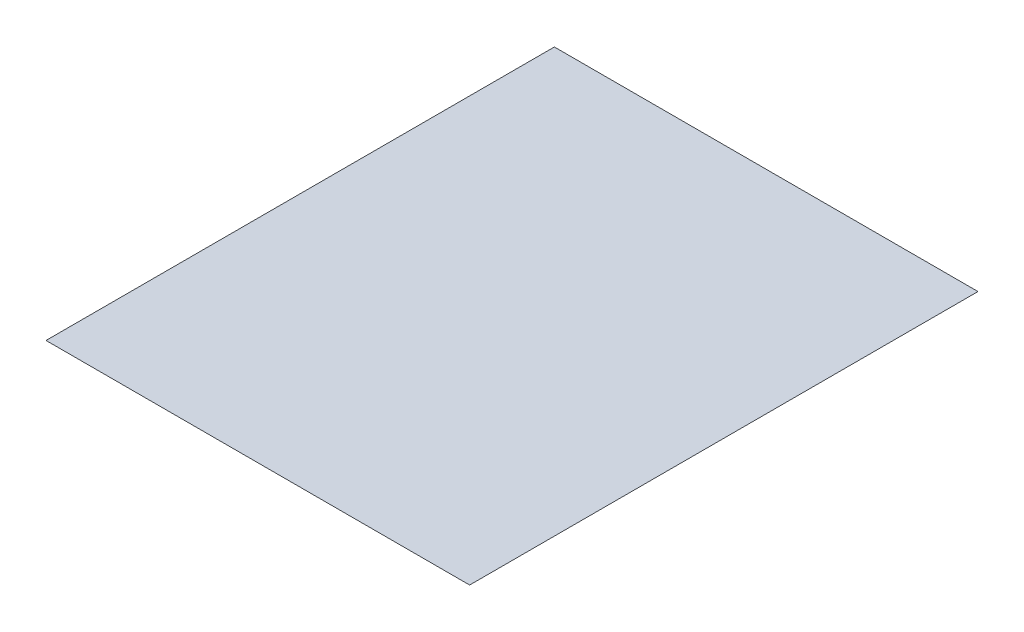
ISO-10303-21;
HEADER;
FILE_DESCRIPTION(('STEP AP214'),'2;1');
FILE_NAME('part.step','',(''),(''),'','','');
FILE_SCHEMA(('AUTOMOTIVE_DESIGN { 1 0 10303 214 1 1 1 1 }'));
ENDSEC;
DATA;
#1=APPLICATION_CONTEXT('core data for automotive mechanical design processes');
#2=APPLICATION_PROTOCOL_DEFINITION('international standard','automotive_design',2000,#1);
#3=PRODUCT_CONTEXT('',#1,'mechanical');
#4=PRODUCT('Part','Part','',(#3));
#5=PRODUCT_RELATED_PRODUCT_CATEGORY('part','',(#4));
#6=PRODUCT_DEFINITION_FORMATION('','',#4);
#7=PRODUCT_DEFINITION_CONTEXT('part definition',#1,'design');
#8=PRODUCT_DEFINITION('design','',#6,#7);
#9=PRODUCT_DEFINITION_SHAPE('','',#8);
#10=(LENGTH_UNIT() NAMED_UNIT(*) SI_UNIT(.MILLI.,.METRE.));
#11=(NAMED_UNIT(*) PLANE_ANGLE_UNIT() SI_UNIT($,.RADIAN.));
#12=(NAMED_UNIT(*) SI_UNIT($,.STERADIAN.) SOLID_ANGLE_UNIT());
#13=UNCERTAINTY_MEASURE_WITH_UNIT(LENGTH_MEASURE(1.E-05),#10,'distance_accuracy_value','');
#14=(GEOMETRIC_REPRESENTATION_CONTEXT(3) GLOBAL_UNCERTAINTY_ASSIGNED_CONTEXT((#13)) GLOBAL_UNIT_ASSIGNED_CONTEXT((#10,
#11,#12)) REPRESENTATION_CONTEXT('',''));
#15=CARTESIAN_POINT('',(0.,0.,0.));
#16=DIRECTION('',(0.,0.,1.));
#17=DIRECTION('',(1.,0.,0.));
#18=AXIS2_PLACEMENT_3D('',#15,#16,#17);
#19=CARTESIAN_POINT('',(0.,180.,22.5));
#20=DIRECTION('',(0.,0.,-1.));
#21=DIRECTION('',(-1.,0.,0.));
#22=AXIS2_PLACEMENT_3D('',#19,#20,#21);
#23=CYLINDRICAL_SURFACE('',#22,5.);
#24=CARTESIAN_POINT('',(0.,180.,22.5));
#25=DIRECTION('',(0.,0.,1.));
#26=DIRECTION('',(1.,0.,0.));
#27=AXIS2_PLACEMENT_3D('',#24,#25,#26);
#28=CIRCLE('',#27,5.);
#29=CARTESIAN_POINT('',(-5.00000000000001,180.,22.5));
#30=VERTEX_POINT('',#29);
#31=EDGE_CURVE('E392',#30,#30,#28,.T.);
#32=CARTESIAN_POINT('',(0.,180.,-22.5));
#33=DIRECTION('',(0.,0.,1.));
#34=DIRECTION('',(1.,0.,0.));
#35=AXIS2_PLACEMENT_3D('',#32,#33,#34);
#36=CIRCLE('',#35,5.);
#37=CARTESIAN_POINT('',(-5.00000000000001,180.,-22.5));
#38=VERTEX_POINT('',#37);
#39=EDGE_CURVE('E389',#38,#38,#36,.T.);
#40=CARTESIAN_POINT('',(-5.00000000000001,180.,22.5));
#41=CARTESIAN_POINT('',(-5.00000000000001,180.,22.03125));
#42=CARTESIAN_POINT('',(-5.00000000000001,180.,21.5625));
#43=CARTESIAN_POINT('',(-5.00000000000001,180.,20.625));
#44=CARTESIAN_POINT('',(-5.00000000000001,180.,20.15625));
#45=CARTESIAN_POINT('',(-5.00000000000001,180.,19.21875));
#46=CARTESIAN_POINT('',(-5.00000000000001,180.,18.75));
#47=CARTESIAN_POINT('',(-5.00000000000001,180.,17.8125));
#48=CARTESIAN_POINT('',(-5.00000000000001,180.,17.34375));
#49=CARTESIAN_POINT('',(-5.00000000000001,180.,16.40625));
#50=CARTESIAN_POINT('',(-5.00000000000001,180.,15.9375));
#51=CARTESIAN_POINT('',(-5.00000000000001,180.,15.));
#52=CARTESIAN_POINT('',(-5.00000000000001,180.,14.53125));
#53=CARTESIAN_POINT('',(-5.00000000000001,180.,13.59375));
#54=CARTESIAN_POINT('',(-5.00000000000001,180.,13.125));
#55=CARTESIAN_POINT('',(-5.00000000000001,180.,12.1875));
#56=CARTESIAN_POINT('',(-5.00000000000001,180.,11.71875));
#57=CARTESIAN_POINT('',(-5.00000000000001,180.,10.78125));
#58=CARTESIAN_POINT('',(-5.00000000000001,180.,10.3125));
#59=CARTESIAN_POINT('',(-5.00000000000001,180.,9.37499999999999));
#60=CARTESIAN_POINT('',(-5.00000000000001,180.,8.90625));
#61=CARTESIAN_POINT('',(-5.00000000000001,180.,7.96874999999999));
#62=CARTESIAN_POINT('',(-5.00000000000001,180.,7.5));
#63=CARTESIAN_POINT('',(-5.00000000000001,180.,6.5625));
#64=CARTESIAN_POINT('',(-5.00000000000001,180.,6.09374999999999));
#65=CARTESIAN_POINT('',(-5.00000000000001,180.,5.15624999999999));
#66=CARTESIAN_POINT('',(-5.00000000000001,180.,4.68749999999999));
#67=CARTESIAN_POINT('',(-5.00000000000001,180.,3.74999999999999));
#68=CARTESIAN_POINT('',(-5.00000000000001,180.,3.28124999999999));
#69=CARTESIAN_POINT('',(-5.00000000000001,180.,2.34375));
#70=CARTESIAN_POINT('',(-5.00000000000001,180.,1.87499999999999));
#71=CARTESIAN_POINT('',(-5.00000000000001,180.,0.937499999999994));
#72=CARTESIAN_POINT('',(-5.00000000000001,180.,0.468749999999993));
#73=CARTESIAN_POINT('',(-5.00000000000001,180.,-0.468750000000007));
#74=CARTESIAN_POINT('',(-5.00000000000001,180.,-0.937500000000008));
#75=CARTESIAN_POINT('',(-5.00000000000001,180.,-1.87500000000001));
#76=CARTESIAN_POINT('',(-5.00000000000001,180.,-2.34375000000001));
#77=CARTESIAN_POINT('',(-5.00000000000001,180.,-3.28125000000001));
#78=CARTESIAN_POINT('',(-5.00000000000001,180.,-3.75000000000001));
#79=CARTESIAN_POINT('',(-5.00000000000001,180.,-4.68750000000001));
#80=CARTESIAN_POINT('',(-5.00000000000001,180.,-5.15625000000001));
#81=CARTESIAN_POINT('',(-5.00000000000001,180.,-6.09375000000001));
#82=CARTESIAN_POINT('',(-5.00000000000001,180.,-6.56250000000001));
#83=CARTESIAN_POINT('',(-5.00000000000001,180.,-7.50000000000001));
#84=CARTESIAN_POINT('',(-5.00000000000001,180.,-7.96875000000001));
#85=CARTESIAN_POINT('',(-5.00000000000001,180.,-8.90625000000001));
#86=CARTESIAN_POINT('',(-5.00000000000001,180.,-9.37500000000001));
#87=CARTESIAN_POINT('',(-5.00000000000001,180.,-10.3125));
#88=CARTESIAN_POINT('',(-5.00000000000001,180.,-10.78125));
#89=CARTESIAN_POINT('',(-5.00000000000001,180.,-11.71875));
#90=CARTESIAN_POINT('',(-5.00000000000001,180.,-12.1875));
#91=CARTESIAN_POINT('',(-5.00000000000001,180.,-13.125));
#92=CARTESIAN_POINT('',(-5.00000000000001,180.,-13.59375));
#93=CARTESIAN_POINT('',(-5.00000000000001,180.,-14.53125));
#94=CARTESIAN_POINT('',(-5.00000000000001,180.,-15.));
#95=CARTESIAN_POINT('',(-5.00000000000001,180.,-15.9375));
#96=CARTESIAN_POINT('',(-5.00000000000001,180.,-16.40625));
#97=CARTESIAN_POINT('',(-5.00000000000001,180.,-17.34375));
#98=CARTESIAN_POINT('',(-5.00000000000001,180.,-17.8125));
#99=CARTESIAN_POINT('',(-5.00000000000001,180.,-18.75));
#100=CARTESIAN_POINT('',(-5.00000000000001,180.,-19.21875));
#101=CARTESIAN_POINT('',(-5.00000000000001,180.,-20.15625));
#102=CARTESIAN_POINT('',(-5.00000000000001,180.,-20.625));
#103=CARTESIAN_POINT('',(-5.00000000000001,180.,-21.5625));
#104=CARTESIAN_POINT('',(-5.00000000000001,180.,-22.03125));
#105=CARTESIAN_POINT('',(-5.00000000000001,180.,-22.5));
#106=B_SPLINE_CURVE_WITH_KNOTS('',3,(#40,#41,#42,#43,#44,#45,#46,#47,#48,#49,#50,#51,#52,#53,
#54,#55,#56,#57,#58,#59,#60,#61,#62,#63,#64,#65,#66,#67,#68,#69,#70,#71,#72,#73,#74,#75,#76,#77,
#78,#79,#80,#81,#82,#83,#84,#85,#86,#87,#88,#89,#90,#91,#92,#93,#94,#95,#96,#97,#98,#99,#100,
#101,#102,#103,#104,#105),.UNSPECIFIED.,.F.,.F.,(4,2,2,2,2,2,2,2,2,2,2,2,2,2,2,2,2,2,2,2,2,2,2,
2,2,2,2,2,2,2,2,2,4),(0.,1.40625,2.8125,4.21875,5.625,7.03125,8.4375,9.84375,11.25,12.65625,
14.0625,15.46875,16.875,18.28125,19.6875,21.09375,22.5,23.90625,25.3125,26.71875,28.125,
29.53125,30.9375,32.34375,33.75,35.15625,36.5625,37.96875,39.375,40.78125,42.1875,43.59375,45.),.UNSPECIFIED.);
#107=EDGE_CURVE('BSEAM41',#30,#38,#106,.T.);
#108=ORIENTED_EDGE('',*,*,#31,.F.);
#109=ORIENTED_EDGE('',*,*,#39,.T.);
#110=ORIENTED_EDGE('',*,*,#107,.T.);
#111=ORIENTED_EDGE('',*,*,#107,.F.);
#112=EDGE_LOOP('',(#108,#110,#109,#111));
#113=FACE_BOUND('',#112,.T.);
#114=ADVANCED_FACE('F41',(#113),#23,.T.);
#115=CARTESIAN_POINT('',(0.,180.,32.5));
#116=DIRECTION('',(0.,0.,-1.));
#117=DIRECTION('',(-1.,0.,0.));
#118=AXIS2_PLACEMENT_3D('',#115,#116,#117);
#119=CYLINDRICAL_SURFACE('',#118,20.);
#120=DIRECTION('',(0.,0.,-1.));
#121=VECTOR('',#120,1.);
#122=CARTESIAN_POINT('',(20.,180.,32.5));
#123=LINE('',#122,#121);
#124=CARTESIAN_POINT('',(20.,180.,32.5));
#125=VERTEX_POINT('',#124);
#126=CARTESIAN_POINT('',(20.,180.,22.5));
#127=VERTEX_POINT('',#126);
#128=EDGE_CURVE('E398',#125,#127,#123,.T.);
#129=ORIENTED_EDGE('',*,*,#128,.F.);
#130=CARTESIAN_POINT('',(0.,180.,32.5));
#131=DIRECTION('',(0.,0.,-1.));
#132=DIRECTION('',(-1.,0.,0.));
#133=AXIS2_PLACEMENT_3D('',#130,#131,#132);
#134=CIRCLE('',#133,20.);
#135=CARTESIAN_POINT('',(-20.,180.,32.5));
#136=VERTEX_POINT('',#135);
#137=EDGE_CURVE('E384',#125,#136,#134,.T.);
#138=ORIENTED_EDGE('',*,*,#137,.T.);
#139=DIRECTION('',(0.,0.,-1.));
#140=VECTOR('',#139,1.);
#141=CARTESIAN_POINT('',(-20.,180.,32.5));
#142=LINE('',#141,#140);
#143=CARTESIAN_POINT('',(-20.,180.,22.5));
#144=VERTEX_POINT('',#143);
#145=EDGE_CURVE('E406',#136,#144,#142,.T.);
#146=ORIENTED_EDGE('',*,*,#145,.T.);
#147=CARTESIAN_POINT('',(0.,180.,22.5));
#148=DIRECTION('',(0.,0.,1.));
#149=DIRECTION('',(1.,0.,0.));
#150=AXIS2_PLACEMENT_3D('',#147,#148,#149);
#151=CIRCLE('',#150,20.);
#152=EDGE_CURVE('E419',#144,#127,#151,.T.);
#153=ORIENTED_EDGE('',*,*,#152,.T.);
#154=EDGE_LOOP('',(#129,#138,#146,#153));
#155=FACE_BOUND('',#154,.T.);
#156=ADVANCED_FACE('F314',(#155),#119,.T.);
#157=CARTESIAN_POINT('',(20.,205.,32.5));
#158=DIRECTION('',(-1.,0.,0.));
#159=DIRECTION('',(0.,0.,1.));
#160=AXIS2_PLACEMENT_3D('',#157,#158,#159);
#161=PLANE('',#160);
#162=DIRECTION('',(0.,1.,0.));
#163=VECTOR('',#162,1.);
#164=CARTESIAN_POINT('',(20.,205.,22.5));
#165=LINE('',#164,#163);
#166=CARTESIAN_POINT('',(20.,205.,22.5));
#167=VERTEX_POINT('',#166);
#168=EDGE_CURVE('E416',#127,#167,#165,.T.);
#169=ORIENTED_EDGE('',*,*,#168,.T.);
#170=DIRECTION('',(0.,0.,-1.));
#171=VECTOR('',#170,1.);
#172=CARTESIAN_POINT('',(20.,205.,32.5));
#173=LINE('',#172,#171);
#174=CARTESIAN_POINT('',(20.,205.,32.5));
#175=VERTEX_POINT('',#174);
#176=EDGE_CURVE('E401',#175,#167,#173,.T.);
#177=ORIENTED_EDGE('',*,*,#176,.F.);
#178=DIRECTION('',(0.,1.,0.));
#179=VECTOR('',#178,1.);
#180=CARTESIAN_POINT('',(20.,205.,32.5));
#181=LINE('',#180,#179);
#182=EDGE_CURVE('E412',#125,#175,#181,.T.);
#183=ORIENTED_EDGE('',*,*,#182,.F.);
#184=ORIENTED_EDGE('',*,*,#128,.T.);
#185=EDGE_LOOP('',(#169,#177,#183,#184));
#186=FACE_BOUND('',#185,.T.);
#187=ADVANCED_FACE('F310',(#186),#161,.F.);
#188=CARTESIAN_POINT('',(-20.,180.,32.5));
#189=DIRECTION('',(1.,0.,0.));
#190=DIRECTION('',(0.,0.,-1.));
#191=AXIS2_PLACEMENT_3D('',#188,#189,#190);
#192=PLANE('',#191);
#193=DIRECTION('',(0.,-1.,0.));
#194=VECTOR('',#193,1.);
#195=CARTESIAN_POINT('',(-20.,180.,22.5));
#196=LINE('',#195,#194);
#197=CARTESIAN_POINT('',(-20.,205.,22.5));
#198=VERTEX_POINT('',#197);
#199=EDGE_CURVE('E410',#198,#144,#196,.T.);
#200=ORIENTED_EDGE('',*,*,#199,.T.);
#201=ORIENTED_EDGE('',*,*,#145,.F.);
#202=DIRECTION('',(0.,-1.,0.));
#203=VECTOR('',#202,1.);
#204=CARTESIAN_POINT('',(-20.,180.,32.5));
#205=LINE('',#204,#203);
#206=CARTESIAN_POINT('',(-20.,205.,32.5));
#207=VERTEX_POINT('',#206);
#208=EDGE_CURVE('E409',#207,#136,#205,.T.);
#209=ORIENTED_EDGE('',*,*,#208,.F.);
#210=DIRECTION('',(0.,0.,-1.));
#211=VECTOR('',#210,1.);
#212=CARTESIAN_POINT('',(-20.,205.,32.5));
#213=LINE('',#212,#211);
#214=EDGE_CURVE('E404',#207,#198,#213,.T.);
#215=ORIENTED_EDGE('',*,*,#214,.T.);
#216=EDGE_LOOP('',(#200,#201,#209,#215));
#217=FACE_BOUND('',#216,.T.);
#218=ADVANCED_FACE('F306',(#217),#192,.F.);
#219=CARTESIAN_POINT('',(0.,180.,22.5));
#220=DIRECTION('',(0.,0.,1.));
#221=DIRECTION('',(1.,0.,0.));
#222=AXIS2_PLACEMENT_3D('',#219,#220,#221);
#223=PLANE('',#222);
#224=ORIENTED_EDGE('',*,*,#31,.T.);
#225=EDGE_LOOP('',(#224));
#226=FACE_BOUND('',#225,.T.);
#227=ORIENTED_EDGE('',*,*,#152,.F.);
#228=ORIENTED_EDGE('',*,*,#199,.F.);
#229=DIRECTION('',(-1.,0.,0.));
#230=VECTOR('',#229,1.);
#231=CARTESIAN_POINT('',(-20.,205.,22.5));
#232=LINE('',#231,#230);
#233=EDGE_CURVE('E413',#167,#198,#232,.T.);
#234=ORIENTED_EDGE('',*,*,#233,.F.);
#235=ORIENTED_EDGE('',*,*,#168,.F.);
#236=EDGE_LOOP('',(#227,#228,#234,#235));
#237=FACE_BOUND('',#236,.T.);
#238=ADVANCED_FACE('F303',(#226,#237),#223,.F.);
#239=CARTESIAN_POINT('',(0.,180.,32.5));
#240=DIRECTION('',(0.,0.,1.));
#241=DIRECTION('',(1.,0.,0.));
#242=AXIS2_PLACEMENT_3D('',#239,#240,#241);
#243=SPHERICAL_SURFACE('',#242,20.);
#244=CARTESIAN_POINT('',(0.,180.,32.5));
#245=DIRECTION('',(0.,-1.,0.));
#246=DIRECTION('',(0.,0.,-1.));
#247=AXIS2_PLACEMENT_3D('',#244,#245,#246);
#248=CIRCLE('',#247,20.);
#249=EDGE_CURVE('E386',#136,#125,#248,.F.);
#250=ORIENTED_EDGE('',*,*,#249,.F.);
#251=ORIENTED_EDGE('',*,*,#137,.F.);
#252=EDGE_LOOP('',(#250,#251));
#253=FACE_BOUND('',#252,.T.);
#254=ADVANCED_FACE('F301',(#253),#243,.T.);
#255=CARTESIAN_POINT('',(0.,205.,32.5));
#256=DIRECTION('',(0.,-1.,0.));
#257=DIRECTION('',(0.,0.,-1.));
#258=AXIS2_PLACEMENT_3D('',#255,#256,#257);
#259=CYLINDRICAL_SURFACE('',#258,20.);
#260=ORIENTED_EDGE('',*,*,#249,.T.);
#261=ORIENTED_EDGE('',*,*,#182,.T.);
#262=CARTESIAN_POINT('',(0.,205.,32.5));
#263=DIRECTION('',(0.,1.,0.));
#264=DIRECTION('',(0.,0.,1.));
#265=AXIS2_PLACEMENT_3D('',#262,#263,#264);
#266=CIRCLE('',#265,20.);
#267=EDGE_CURVE('E395',#207,#175,#266,.T.);
#268=ORIENTED_EDGE('',*,*,#267,.F.);
#269=ORIENTED_EDGE('',*,*,#208,.T.);
#270=EDGE_LOOP('',(#260,#261,#268,#269));
#271=FACE_BOUND('',#270,.T.);
#272=ADVANCED_FACE('F297',(#271),#259,.T.);
#273=CARTESIAN_POINT('',(0.,180.,-52.5));
#274=DIRECTION('',(0.,0.,1.));
#275=DIRECTION('',(1.,0.,0.));
#276=AXIS2_PLACEMENT_3D('',#273,#274,#275);
#277=CYLINDRICAL_SURFACE('',#276,20.);
#278=DIRECTION('',(0.,0.,1.));
#279=VECTOR('',#278,1.);
#280=CARTESIAN_POINT('',(-20.,180.,-52.5));
#281=LINE('',#280,#279);
#282=CARTESIAN_POINT('',(-20.,180.,-32.5));
#283=VERTEX_POINT('',#282);
#284=CARTESIAN_POINT('',(-20.,180.,-22.5));
#285=VERTEX_POINT('',#284);
#286=EDGE_CURVE('E249',#283,#285,#281,.T.);
#287=ORIENTED_EDGE('',*,*,#286,.F.);
#288=CARTESIAN_POINT('',(0.,180.,-32.5));
#289=DIRECTION('',(0.,0.,1.));
#290=DIRECTION('',(1.,0.,0.));
#291=AXIS2_PLACEMENT_3D('',#288,#289,#290);
#292=CIRCLE('',#291,20.);
#293=CARTESIAN_POINT('',(20.,180.,-32.5));
#294=VERTEX_POINT('',#293);
#295=EDGE_CURVE('E346',#283,#294,#292,.T.);
#296=ORIENTED_EDGE('',*,*,#295,.T.);
#297=DIRECTION('',(0.,0.,1.));
#298=VECTOR('',#297,1.);
#299=CARTESIAN_POINT('',(20.,180.,-52.5));
#300=LINE('',#299,#298);
#301=CARTESIAN_POINT('',(20.,180.,-22.5));
#302=VERTEX_POINT('',#301);
#303=EDGE_CURVE('E247',#294,#302,#300,.T.);
#304=ORIENTED_EDGE('',*,*,#303,.T.);
#305=CARTESIAN_POINT('',(0.,180.,-22.5));
#306=DIRECTION('',(0.,0.,-1.));
#307=DIRECTION('',(-1.,0.,0.));
#308=AXIS2_PLACEMENT_3D('',#305,#306,#307);
#309=CIRCLE('',#308,20.);
#310=EDGE_CURVE('E370',#302,#285,#309,.T.);
#311=ORIENTED_EDGE('',*,*,#310,.T.);
#312=EDGE_LOOP('',(#287,#296,#304,#311));
#313=FACE_BOUND('',#312,.T.);
#314=ADVANCED_FACE('F292',(#313),#277,.T.);
#315=CARTESIAN_POINT('',(-20.,180.,-52.5));
#316=DIRECTION('',(1.,0.,0.));
#317=DIRECTION('',(0.,1.,0.));
#318=AXIS2_PLACEMENT_3D('',#315,#316,#317);
#319=PLANE('',#318);
#320=DIRECTION('',(0.,0.,1.));
#321=VECTOR('',#320,1.);
#322=CARTESIAN_POINT('',(-20.,205.,-52.5));
#323=LINE('',#322,#321);
#324=CARTESIAN_POINT('',(-20.,205.,-32.5));
#325=VERTEX_POINT('',#324);
#326=CARTESIAN_POINT('',(-20.,205.,-22.5));
#327=VERTEX_POINT('',#326);
#328=EDGE_CURVE('E246',#325,#327,#323,.T.);
#329=ORIENTED_EDGE('',*,*,#328,.F.);
#330=CARTESIAN_POINT('',(-20.,180.,-32.5));
#331=CARTESIAN_POINT('',(-20.,188.75,-32.5));
#332=CARTESIAN_POINT('',(-20.,197.5,-32.5));
#333=CARTESIAN_POINT('',(-20.,206.25,-32.5));
#334=(BOUNDED_CURVE() B_SPLINE_CURVE(3,(#330,#331,#332,#333),.UNSPECIFIED.,.F.,
.F.) B_SPLINE_CURVE_WITH_KNOTS((4,4),(-0.02625,0.),
.UNSPECIFIED.) CURVE() GEOMETRIC_REPRESENTATION_ITEM() RATIONAL_B_SPLINE_CURVE((1.,1.,1.,1.)) REPRESENTATION_ITEM(''));
#335=EDGE_CURVE('E165',#325,#283,#334,.F.);
#336=ORIENTED_EDGE('',*,*,#335,.T.);
#337=ORIENTED_EDGE('',*,*,#286,.T.);
#338=DIRECTION('',(0.,1.,0.));
#339=VECTOR('',#338,1.);
#340=CARTESIAN_POINT('',(-20.,180.,-22.5));
#341=LINE('',#340,#339);
#342=EDGE_CURVE('E378',#285,#327,#341,.T.);
#343=ORIENTED_EDGE('',*,*,#342,.T.);
#344=EDGE_LOOP('',(#329,#336,#337,#343));
#345=FACE_BOUND('',#344,.T.);
#346=ADVANCED_FACE('F282',(#345),#319,.F.);
#347=CARTESIAN_POINT('',(20.,205.,-52.5));
#348=DIRECTION('',(-1.,0.,0.));
#349=DIRECTION('',(0.,-1.,0.));
#350=AXIS2_PLACEMENT_3D('',#347,#348,#349);
#351=PLANE('',#350);
#352=ORIENTED_EDGE('',*,*,#303,.F.);
#353=CARTESIAN_POINT('',(20.,206.25,-32.5));
#354=CARTESIAN_POINT('',(20.,197.5,-32.5));
#355=CARTESIAN_POINT('',(20.,188.75,-32.5));
#356=CARTESIAN_POINT('',(20.,180.,-32.5));
#357=(BOUNDED_CURVE() B_SPLINE_CURVE(3,(#353,#354,#355,#356),.UNSPECIFIED.,.F.,
.F.) B_SPLINE_CURVE_WITH_KNOTS((4,4),(0.,0.02625),
.UNSPECIFIED.) CURVE() GEOMETRIC_REPRESENTATION_ITEM() RATIONAL_B_SPLINE_CURVE((1.,1.,1.,1.)) REPRESENTATION_ITEM(''));
#358=CARTESIAN_POINT('',(20.,205.,-32.5));
#359=VERTEX_POINT('',#358);
#360=EDGE_CURVE('E228',#294,#359,#357,.F.);
#361=ORIENTED_EDGE('',*,*,#360,.T.);
#362=DIRECTION('',(0.,0.,1.));
#363=VECTOR('',#362,1.);
#364=CARTESIAN_POINT('',(20.,205.,-52.5));
#365=LINE('',#364,#363);
#366=CARTESIAN_POINT('',(20.,205.,-22.5));
#367=VERTEX_POINT('',#366);
#368=EDGE_CURVE('E238',#359,#367,#365,.T.);
#369=ORIENTED_EDGE('',*,*,#368,.T.);
#370=DIRECTION('',(0.,-1.,0.));
#371=VECTOR('',#370,1.);
#372=CARTESIAN_POINT('',(20.,205.,-22.5));
#373=LINE('',#372,#371);
#374=EDGE_CURVE('E251',#367,#302,#373,.T.);
#375=ORIENTED_EDGE('',*,*,#374,.T.);
#376=EDGE_LOOP('',(#352,#361,#369,#375));
#377=FACE_BOUND('',#376,.T.);
#378=ADVANCED_FACE('F291',(#377),#351,.F.);
#379=CARTESIAN_POINT('',(0.,180.,-22.5));
#380=DIRECTION('',(0.,0.,-1.));
#381=DIRECTION('',(-1.,0.,0.));
#382=AXIS2_PLACEMENT_3D('',#379,#380,#381);
#383=PLANE('',#382);
#384=ORIENTED_EDGE('',*,*,#39,.F.);
#385=EDGE_LOOP('',(#384));
#386=FACE_BOUND('',#385,.T.);
#387=ORIENTED_EDGE('',*,*,#310,.F.);
#388=ORIENTED_EDGE('',*,*,#374,.F.);
#389=DIRECTION('',(1.,0.,0.));
#390=VECTOR('',#389,1.);
#391=CARTESIAN_POINT('',(-20.,205.,-22.5));
#392=LINE('',#391,#390);
#393=EDGE_CURVE('E243',#327,#367,#392,.T.);
#394=ORIENTED_EDGE('',*,*,#393,.F.);
#395=ORIENTED_EDGE('',*,*,#342,.F.);
#396=EDGE_LOOP('',(#387,#388,#394,#395));
#397=FACE_BOUND('',#396,.T.);
#398=ADVANCED_FACE('F188',(#386,#397),#383,.F.);
#399=CARTESIAN_POINT('',(20.,180.,-32.5));
#400=CARTESIAN_POINT('',(20.,188.75,-32.5));
#401=CARTESIAN_POINT('',(20.,197.5,-32.5));
#402=CARTESIAN_POINT('',(20.,206.25,-32.5));
#403=CARTESIAN_POINT('',(20.,180.,-52.5));
#404=CARTESIAN_POINT('',(19.9999999998179,188.75,-52.4999999997571));
#405=CARTESIAN_POINT('',(20.,197.5,-52.5));
#406=CARTESIAN_POINT('',(20.,206.25,-52.5));
#407=CARTESIAN_POINT('',(0.,180.,-52.5));
#408=CARTESIAN_POINT('',(0.,188.75,-52.5));
#409=CARTESIAN_POINT('',(0.,197.5,-52.5));
#410=CARTESIAN_POINT('',(0.,206.25,-52.5));
#411=(BOUNDED_SURFACE() B_SPLINE_SURFACE(2,3,((#399,#400,#401,#402),(#403,#404,#405,#406),(#407,
#408,#409,#410)),.UNSPECIFIED.,.F.,.F.,.F.) B_SPLINE_SURFACE_WITH_KNOTS((3,3),(4,4),(0.,1.),(0.,
0.02625),.UNSPECIFIED.) GEOMETRIC_REPRESENTATION_ITEM() RATIONAL_B_SPLINE_SURFACE(((1.,1.,1.,
1.),(0.707106781186548,0.707106781186548,0.707106781186548,0.707106781186548),(1.,1.,1.,1.))) REPRESENTATION_ITEM('') SURFACE());
#412=CARTESIAN_POINT('',(0.,206.25,-52.5));
#413=CARTESIAN_POINT('',(0.,197.5,-52.5));
#414=CARTESIAN_POINT('',(0.,188.75,-52.5));
#415=CARTESIAN_POINT('',(0.,180.,-52.5));
#416=(BOUNDED_CURVE() B_SPLINE_CURVE(3,(#412,#413,#414,#415),.UNSPECIFIED.,.F.,
.F.) B_SPLINE_CURVE_WITH_KNOTS((4,4),(-0.02625,0.),
.UNSPECIFIED.) CURVE() GEOMETRIC_REPRESENTATION_ITEM() RATIONAL_B_SPLINE_CURVE((1.,1.,1.,1.)) REPRESENTATION_ITEM(''));
#417=CARTESIAN_POINT('',(0.,205.,-52.5));
#418=VERTEX_POINT('',#417);
#419=CARTESIAN_POINT('',(0.,180.,-52.5));
#420=VERTEX_POINT('',#419);
#421=EDGE_CURVE('E230',#418,#420,#416,.T.);
#422=CARTESIAN_POINT('',(0.,205.,-52.5));
#423=CARTESIAN_POINT('',(19.9999999999988,205.,-52.4999999999984));
#424=CARTESIAN_POINT('',(20.,205.,-32.5));
#425=(BOUNDED_CURVE() B_SPLINE_CURVE(2,(#422,#423,#424),.UNSPECIFIED.,.F.,
.F.) B_SPLINE_CURVE_WITH_KNOTS((3,3),(0.,1.),
.UNSPECIFIED.) CURVE() GEOMETRIC_REPRESENTATION_ITEM() RATIONAL_B_SPLINE_CURVE((1.,
0.707106781186548,1.)) REPRESENTATION_ITEM(''));
#426=EDGE_CURVE('E225',#359,#418,#425,.F.);
#427=CARTESIAN_POINT('',(20.,180.,-32.5));
#428=CARTESIAN_POINT('',(20.,180.,-52.5));
#429=CARTESIAN_POINT('',(0.,180.,-52.5));
#430=(BOUNDED_CURVE() B_SPLINE_CURVE(2,(#427,#428,#429),.UNSPECIFIED.,.F.,
.F.) B_SPLINE_CURVE_WITH_KNOTS((3,3),(0.,1.),
.UNSPECIFIED.) CURVE() GEOMETRIC_REPRESENTATION_ITEM() RATIONAL_B_SPLINE_CURVE((1.,
0.707106781186548,1.)) REPRESENTATION_ITEM(''));
#431=EDGE_CURVE('E342',#420,#294,#430,.F.);
#432=ORIENTED_EDGE('',*,*,#421,.F.);
#433=ORIENTED_EDGE('',*,*,#426,.F.);
#434=ORIENTED_EDGE('',*,*,#360,.F.);
#435=ORIENTED_EDGE('',*,*,#431,.F.);
#436=EDGE_LOOP('',(#432,#433,#434,#435));
#437=FACE_BOUND('',#436,.T.);
#438=ADVANCED_FACE('F173',(#437),#411,.T.);
#439=CARTESIAN_POINT('',(-20.,206.25,-32.5));
#440=CARTESIAN_POINT('',(-20.,197.5,-32.5));
#441=CARTESIAN_POINT('',(-20.,188.75,-32.5));
#442=CARTESIAN_POINT('',(-20.,180.,-32.5));
#443=CARTESIAN_POINT('',(-20.,206.25,-52.5));
#444=CARTESIAN_POINT('',(-20.,197.5,-52.5));
#445=CARTESIAN_POINT('',(-19.9999999998179,188.75,-52.4999999997571));
#446=CARTESIAN_POINT('',(-20.,180.,-52.5));
#447=CARTESIAN_POINT('',(0.,206.25,-52.5));
#448=CARTESIAN_POINT('',(0.,197.5,-52.5));
#449=CARTESIAN_POINT('',(0.,188.75,-52.5));
#450=CARTESIAN_POINT('',(0.,180.,-52.5));
#451=(BOUNDED_SURFACE() B_SPLINE_SURFACE(2,3,((#439,#440,#441,#442),(#443,#444,#445,#446),(#447,
#448,#449,#450)),.UNSPECIFIED.,.F.,.F.,.F.) B_SPLINE_SURFACE_WITH_KNOTS((3,3),(4,4),(0.,1.),
(-0.02625,0.),.UNSPECIFIED.) GEOMETRIC_REPRESENTATION_ITEM() RATIONAL_B_SPLINE_SURFACE(((1.,1.,
1.,1.),(0.707106781186548,0.707106781186548,0.707106781186548,0.707106781186548),(1.,1.,1.,1.))) REPRESENTATION_ITEM('') SURFACE());
#452=CARTESIAN_POINT('',(-20.,205.,-32.5));
#453=CARTESIAN_POINT('',(-19.9999999999988,205.,-52.4999999999984));
#454=CARTESIAN_POINT('',(0.,205.,-52.5));
#455=(BOUNDED_CURVE() B_SPLINE_CURVE(2,(#452,#453,#454),.UNSPECIFIED.,.F.,
.F.) B_SPLINE_CURVE_WITH_KNOTS((3,3),(0.,1.),
.UNSPECIFIED.) CURVE() GEOMETRIC_REPRESENTATION_ITEM() RATIONAL_B_SPLINE_CURVE((1.,
0.707106781186548,1.)) REPRESENTATION_ITEM(''));
#456=EDGE_CURVE('E235',#418,#325,#455,.F.);
#457=CARTESIAN_POINT('',(0.,180.,-52.5));
#458=CARTESIAN_POINT('',(-20.,180.,-52.5));
#459=CARTESIAN_POINT('',(-20.,180.,-32.5));
#460=(BOUNDED_CURVE() B_SPLINE_CURVE(2,(#457,#458,#459),.UNSPECIFIED.,.F.,
.F.) B_SPLINE_CURVE_WITH_KNOTS((3,3),(0.,1.),
.UNSPECIFIED.) CURVE() GEOMETRIC_REPRESENTATION_ITEM() RATIONAL_B_SPLINE_CURVE((1.,
0.707106781186548,1.)) REPRESENTATION_ITEM(''));
#461=EDGE_CURVE('E344',#283,#420,#460,.F.);
#462=ORIENTED_EDGE('',*,*,#456,.F.);
#463=ORIENTED_EDGE('',*,*,#421,.T.);
#464=ORIENTED_EDGE('',*,*,#461,.F.);
#465=ORIENTED_EDGE('',*,*,#335,.F.);
#466=EDGE_LOOP('',(#462,#463,#464,#465));
#467=FACE_BOUND('',#466,.T.);
#468=ADVANCED_FACE('F187',(#467),#451,.T.);
#469=CARTESIAN_POINT('',(0.,180.,-32.5));
#470=DIRECTION('',(0.,0.,-1.));
#471=DIRECTION('',(-1.,0.,0.));
#472=AXIS2_PLACEMENT_3D('',#469,#470,#471);
#473=SPHERICAL_SURFACE('',#472,20.);
#474=ORIENTED_EDGE('',*,*,#431,.T.);
#475=ORIENTED_EDGE('',*,*,#295,.F.);
#476=ORIENTED_EDGE('',*,*,#461,.T.);
#477=EDGE_LOOP('',(#474,#475,#476));
#478=FACE_BOUND('',#477,.T.);
#479=ADVANCED_FACE('F324',(#478),#473,.T.);
#480=CARTESIAN_POINT('',(0.,205.,0.));
#481=DIRECTION('',(0.,1.,0.));
#482=DIRECTION('',(0.,0.,1.));
#483=AXIS2_PLACEMENT_3D('',#480,#481,#482);
#484=PLANE('',#483);
#485=DIRECTION('',(1.,0.,0.));
#486=VECTOR('',#485,1.);
#487=CARTESIAN_POINT('',(0.,205.,-110.));
#488=LINE('',#487,#486);
#489=CARTESIAN_POINT('',(-90.,205.,-110.));
#490=VERTEX_POINT('',#489);
#491=CARTESIAN_POINT('',(90.,205.,-110.));
#492=VERTEX_POINT('',#491);
#493=EDGE_CURVE('E51',#490,#492,#488,.T.);
#494=ORIENTED_EDGE('',*,*,#493,.T.);
#495=DIRECTION('',(0.,0.,1.));
#496=VECTOR('',#495,1.);
#497=CARTESIAN_POINT('',(90.0000000000001,205.,120.));
#498=LINE('',#497,#496);
#499=CARTESIAN_POINT('',(90.0000000000001,205.,110.));
#500=VERTEX_POINT('',#499);
#501=EDGE_CURVE('E12',#492,#500,#498,.T.);
#502=ORIENTED_EDGE('',*,*,#501,.T.);
#503=DIRECTION('',(-1.,0.,0.));
#504=VECTOR('',#503,1.);
#505=CARTESIAN_POINT('',(-99.9999999999999,205.,110.));
#506=LINE('',#505,#504);
#507=CARTESIAN_POINT('',(-90.,205.,110.));
#508=VERTEX_POINT('',#507);
#509=EDGE_CURVE('E163',#500,#508,#506,.T.);
#510=ORIENTED_EDGE('',*,*,#509,.T.);
#511=DIRECTION('',(0.,0.,-1.));
#512=VECTOR('',#511,1.);
#513=CARTESIAN_POINT('',(-90.,205.,0.));
#514=LINE('',#513,#512);
#515=EDGE_CURVE('E62',#508,#490,#514,.T.);
#516=ORIENTED_EDGE('',*,*,#515,.T.);
#517=EDGE_LOOP('',(#494,#502,#510,#516));
#518=FACE_BOUND('',#517,.T.);
#519=ORIENTED_EDGE('',*,*,#368,.F.);
#520=ORIENTED_EDGE('',*,*,#426,.T.);
#521=ORIENTED_EDGE('',*,*,#456,.T.);
#522=ORIENTED_EDGE('',*,*,#328,.T.);
#523=ORIENTED_EDGE('',*,*,#393,.T.);
#524=EDGE_LOOP('',(#519,#520,#521,#522,#523));
#525=FACE_BOUND('',#524,.T.);
#526=ORIENTED_EDGE('',*,*,#176,.T.);
#527=ORIENTED_EDGE('',*,*,#233,.T.);
#528=ORIENTED_EDGE('',*,*,#214,.F.);
#529=ORIENTED_EDGE('',*,*,#267,.T.);
#530=EDGE_LOOP('',(#526,#527,#528,#529));
#531=FACE_BOUND('',#530,.T.);
#532=ADVANCED_FACE('F239',(#518,#525,#531),#484,.F.);
#533=CARTESIAN_POINT('',(0.,215.,0.));
#534=DIRECTION('',(0.,1.,0.));
#535=DIRECTION('',(0.,0.,1.));
#536=AXIS2_PLACEMENT_3D('',#533,#534,#535);
#537=PLANE('',#536);
#538=DIRECTION('',(-1.,0.,0.));
#539=VECTOR('',#538,1.);
#540=CARTESIAN_POINT('',(100.,215.,-120.));
#541=LINE('',#540,#539);
#542=CARTESIAN_POINT('',(100.,215.,-120.));
#543=VERTEX_POINT('',#542);
#544=CARTESIAN_POINT('',(-100.,215.,-120.));
#545=VERTEX_POINT('',#544);
#546=EDGE_CURVE('E137',#543,#545,#541,.T.);
#547=ORIENTED_EDGE('',*,*,#546,.T.);
#548=DIRECTION('',(0.,0.,1.));
#549=VECTOR('',#548,1.);
#550=CARTESIAN_POINT('',(-100.,215.,-120.));
#551=LINE('',#550,#549);
#552=CARTESIAN_POINT('',(-99.9999999999999,215.,120.));
#553=VERTEX_POINT('',#552);
#554=EDGE_CURVE('E140',#545,#553,#551,.T.);
#555=ORIENTED_EDGE('',*,*,#554,.T.);
#556=DIRECTION('',(-1.,0.,0.));
#557=VECTOR('',#556,1.);
#558=CARTESIAN_POINT('',(100.,215.,120.));
#559=LINE('',#558,#557);
#560=CARTESIAN_POINT('',(100.,215.,120.));
#561=VERTEX_POINT('',#560);
#562=EDGE_CURVE('E151',#561,#553,#559,.T.);
#563=ORIENTED_EDGE('',*,*,#562,.F.);
#564=DIRECTION('',(0.,0.,1.));
#565=VECTOR('',#564,1.);
#566=CARTESIAN_POINT('',(100.,215.,-120.));
#567=LINE('',#566,#565);
#568=EDGE_CURVE('E143',#543,#561,#567,.T.);
#569=ORIENTED_EDGE('',*,*,#568,.F.);
#570=EDGE_LOOP('',(#547,#555,#563,#569));
#571=FACE_BOUND('',#570,.T.);
#572=ADVANCED_FACE('F139',(#571),#537,.T.);
#573=CARTESIAN_POINT('',(-100.,215.,-120.));
#574=DIRECTION('',(0.707106781186548,0.707106781186546,0.));
#575=DIRECTION('',(0.,0.,1.));
#576=AXIS2_PLACEMENT_3D('',#573,#574,#575);
#577=PLANE('',#576);
#578=DIRECTION('',(-0.577350269189625,0.577350269189627,0.577350269189625));
#579=VECTOR('',#578,1.);
#580=CARTESIAN_POINT('',(-60.,175.,80.0000000000001));
#581=LINE('',#580,#579);
#582=EDGE_CURVE('E149',#553,#508,#581,.F.);
#583=ORIENTED_EDGE('',*,*,#582,.F.);
#584=ORIENTED_EDGE('',*,*,#554,.F.);
#585=DIRECTION('',(0.577350269189625,-0.577350269189627,0.577350269189625));
#586=VECTOR('',#585,1.);
#587=CARTESIAN_POINT('',(-100.,215.,-120.));
#588=LINE('',#587,#586);
#589=EDGE_CURVE('E46',#490,#545,#588,.F.);
#590=ORIENTED_EDGE('',*,*,#589,.F.);
#591=ORIENTED_EDGE('',*,*,#515,.F.);
#592=EDGE_LOOP('',(#583,#584,#590,#591));
#593=FACE_BOUND('',#592,.T.);
#594=ADVANCED_FACE('F44',(#593),#577,.F.);
#595=CARTESIAN_POINT('',(100.,215.,-120.));
#596=DIRECTION('',(0.,0.707106781186547,0.707106781186548));
#597=DIRECTION('',(-1.,0.,0.));
#598=AXIS2_PLACEMENT_3D('',#595,#596,#597);
#599=PLANE('',#598);
#600=ORIENTED_EDGE('',*,*,#589,.T.);
#601=ORIENTED_EDGE('',*,*,#546,.F.);
#602=DIRECTION('',(0.577350269189625,0.577350269189627,-0.577350269189626));
#603=VECTOR('',#602,1.);
#604=CARTESIAN_POINT('',(100.,215.,-120.));
#605=LINE('',#604,#603);
#606=EDGE_CURVE('E154',#492,#543,#605,.T.);
#607=ORIENTED_EDGE('',*,*,#606,.F.);
#608=ORIENTED_EDGE('',*,*,#493,.F.);
#609=EDGE_LOOP('',(#600,#601,#607,#608));
#610=FACE_BOUND('',#609,.T.);
#611=ADVANCED_FACE('F153',(#610),#599,.F.);
#612=CARTESIAN_POINT('',(0.,205.,110.));
#613=DIRECTION('',(0.,-0.707106781186546,0.707106781186549));
#614=DIRECTION('',(1.,0.,0.));
#615=AXIS2_PLACEMENT_3D('',#612,#613,#614);
#616=PLANE('',#615);
#617=ORIENTED_EDGE('',*,*,#582,.T.);
#618=ORIENTED_EDGE('',*,*,#509,.F.);
#619=DIRECTION('',(0.577350269189625,0.577350269189627,0.577350269189625));
#620=VECTOR('',#619,1.);
#621=CARTESIAN_POINT('',(60.0000000000001,175.,80.0000000000001));
#622=LINE('',#621,#620);
#623=EDGE_CURVE('E157',#561,#500,#622,.F.);
#624=ORIENTED_EDGE('',*,*,#623,.F.);
#625=ORIENTED_EDGE('',*,*,#562,.T.);
#626=EDGE_LOOP('',(#617,#618,#624,#625));
#627=FACE_BOUND('',#626,.T.);
#628=ADVANCED_FACE('F549',(#627),#616,.T.);
#629=CARTESIAN_POINT('',(90.,205.,0.));
#630=DIRECTION('',(0.707106781186548,-0.707106781186546,0.));
#631=DIRECTION('',(0.,0.,-1.));
#632=AXIS2_PLACEMENT_3D('',#629,#630,#631);
#633=PLANE('',#632);
#634=ORIENTED_EDGE('',*,*,#606,.T.);
#635=ORIENTED_EDGE('',*,*,#568,.T.);
#636=ORIENTED_EDGE('',*,*,#623,.T.);
#637=ORIENTED_EDGE('',*,*,#501,.F.);
#638=EDGE_LOOP('',(#634,#635,#636,#637));
#639=FACE_BOUND('',#638,.T.);
#640=ADVANCED_FACE('F195',(#639),#633,.T.);
#641=CLOSED_SHELL('',(#114,#156,#187,#218,#238,#254,#272,#314,#346,#378,#398,#438,#468,#479,
#532,#572,#594,#611,#628,#640));
#642=MANIFOLD_SOLID_BREP('B2',#641);
#643=ADVANCED_BREP_SHAPE_REPRESENTATION('',(#18,#642),#14);
#644=SHAPE_DEFINITION_REPRESENTATION(#9,#643);
ENDSEC;
END-ISO-10303-21;
